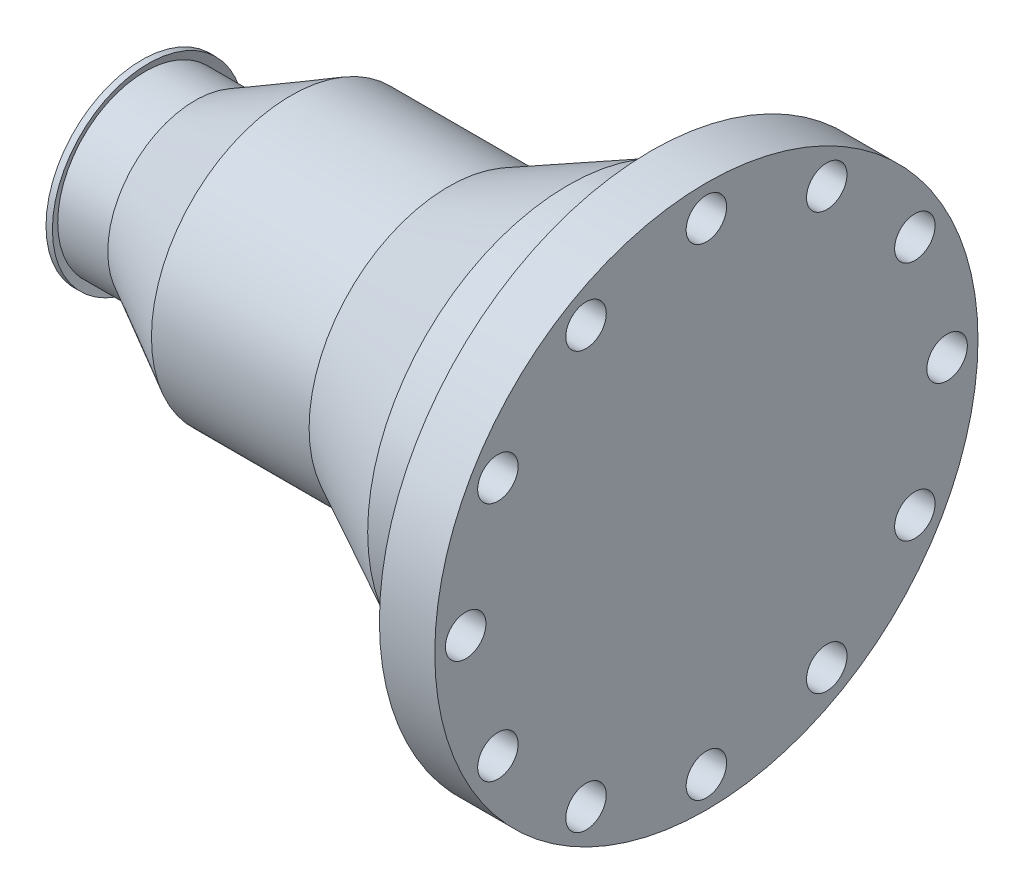
ISO-10303-21;
HEADER;
FILE_DESCRIPTION(('STEP AP214'),'2;1');
FILE_NAME('part.step','',(''),(''),'','','');
FILE_SCHEMA(('AUTOMOTIVE_DESIGN { 1 0 10303 214 1 1 1 1 }'));
ENDSEC;
DATA;
#1=APPLICATION_CONTEXT('core data for automotive mechanical design processes');
#2=APPLICATION_PROTOCOL_DEFINITION('international standard','automotive_design',2000,#1);
#3=PRODUCT_CONTEXT('',#1,'mechanical');
#4=PRODUCT('Part','Part','',(#3));
#5=PRODUCT_RELATED_PRODUCT_CATEGORY('part','',(#4));
#6=PRODUCT_DEFINITION_FORMATION('','',#4);
#7=PRODUCT_DEFINITION_CONTEXT('part definition',#1,'design');
#8=PRODUCT_DEFINITION('design','',#6,#7);
#9=PRODUCT_DEFINITION_SHAPE('','',#8);
#10=(LENGTH_UNIT() NAMED_UNIT(*) SI_UNIT(.MILLI.,.METRE.));
#11=(NAMED_UNIT(*) PLANE_ANGLE_UNIT() SI_UNIT($,.RADIAN.));
#12=(NAMED_UNIT(*) SI_UNIT($,.STERADIAN.) SOLID_ANGLE_UNIT());
#13=UNCERTAINTY_MEASURE_WITH_UNIT(LENGTH_MEASURE(1.E-05),#10,'distance_accuracy_value','');
#14=(GEOMETRIC_REPRESENTATION_CONTEXT(3) GLOBAL_UNCERTAINTY_ASSIGNED_CONTEXT((#13)) GLOBAL_UNIT_ASSIGNED_CONTEXT((#10,
#11,#12)) REPRESENTATION_CONTEXT('',''));
#15=CARTESIAN_POINT('',(0.,0.,0.));
#16=DIRECTION('',(0.,0.,1.));
#17=DIRECTION('',(1.,0.,0.));
#18=AXIS2_PLACEMENT_3D('',#15,#16,#17);
#19=CARTESIAN_POINT('',(0.,0.,0.));
#20=DIRECTION('',(1.,0.,0.));
#21=DIRECTION('',(0.,0.,-1.));
#22=AXIS2_PLACEMENT_3D('',#19,#20,#21);
#23=PLANE('',#22);
#24=CARTESIAN_POINT('',(0.,0.,0.));
#25=DIRECTION('',(-1.,0.,0.));
#26=DIRECTION('',(0.,0.,1.));
#27=AXIS2_PLACEMENT_3D('',#24,#25,#26);
#28=CIRCLE('',#27,31.);
#29=CARTESIAN_POINT('',(0.,0.,31.));
#30=VERTEX_POINT('',#29);
#31=EDGE_CURVE('E80',#30,#30,#28,.T.);
#32=ORIENTED_EDGE('',*,*,#31,.F.);
#33=EDGE_LOOP('',(#32));
#34=FACE_BOUND('',#33,.T.);
#35=CARTESIAN_POINT('',(0.,0.,0.));
#36=DIRECTION('',(-1.,0.,0.));
#37=DIRECTION('',(0.,0.,1.));
#38=AXIS2_PLACEMENT_3D('',#35,#36,#37);
#39=CIRCLE('',#38,45.);
#40=CARTESIAN_POINT('',(0.,0.,45.));
#41=VERTEX_POINT('',#40);
#42=EDGE_CURVE('E10',#41,#41,#39,.T.);
#43=ORIENTED_EDGE('',*,*,#42,.T.);
#44=EDGE_LOOP('',(#43));
#45=FACE_BOUND('',#44,.T.);
#46=ADVANCED_FACE('F37',(#34,#45),#23,.F.);
#47=CARTESIAN_POINT('',(0.,0.,0.));
#48=DIRECTION('',(-1.,0.,0.));
#49=DIRECTION('',(0.,0.,1.));
#50=AXIS2_PLACEMENT_3D('',#47,#48,#49);
#51=CYLINDRICAL_SURFACE('',#50,45.);
#52=ORIENTED_EDGE('',*,*,#42,.F.);
#53=EDGE_LOOP('',(#52));
#54=FACE_BOUND('',#53,.T.);
#55=CARTESIAN_POINT('',(3.,0.,0.));
#56=DIRECTION('',(-1.,0.,0.));
#57=DIRECTION('',(0.,0.,1.));
#58=AXIS2_PLACEMENT_3D('',#55,#56,#57);
#59=CIRCLE('',#58,45.);
#60=CARTESIAN_POINT('',(3.,0.,45.));
#61=VERTEX_POINT('',#60);
#62=EDGE_CURVE('E43',#61,#61,#59,.T.);
#63=ORIENTED_EDGE('',*,*,#62,.T.);
#64=EDGE_LOOP('',(#63));
#65=FACE_BOUND('',#64,.T.);
#66=ADVANCED_FACE('F214',(#54,#65),#51,.T.);
#67=CARTESIAN_POINT('',(1.5,0.,0.));
#68=DIRECTION('',(1.,0.,0.));
#69=DIRECTION('',(0.,0.,-1.));
#70=AXIS2_PLACEMENT_3D('',#67,#68,#69);
#71=CONICAL_SURFACE('',#70,41.,1.21202565652432);
#72=ORIENTED_EDGE('',*,*,#62,.F.);
#73=EDGE_LOOP('',(#72));
#74=FACE_BOUND('',#73,.T.);
#75=CARTESIAN_POINT('',(1.5,0.,0.));
#76=DIRECTION('',(-1.,0.,0.));
#77=DIRECTION('',(0.,0.,1.));
#78=AXIS2_PLACEMENT_3D('',#75,#76,#77);
#79=CIRCLE('',#78,41.);
#80=CARTESIAN_POINT('',(1.5,0.,41.));
#81=VERTEX_POINT('',#80);
#82=EDGE_CURVE('E47',#81,#81,#79,.T.);
#83=ORIENTED_EDGE('',*,*,#82,.T.);
#84=EDGE_LOOP('',(#83));
#85=FACE_BOUND('',#84,.T.);
#86=ADVANCED_FACE('F220',(#74,#85),#71,.F.);
#87=CARTESIAN_POINT('',(0.,0.,0.));
#88=DIRECTION('',(-1.,0.,0.));
#89=DIRECTION('',(0.,0.,1.));
#90=AXIS2_PLACEMENT_3D('',#87,#88,#89);
#91=CYLINDRICAL_SURFACE('',#90,41.);
#92=ORIENTED_EDGE('',*,*,#82,.F.);
#93=EDGE_LOOP('',(#92));
#94=FACE_BOUND('',#93,.T.);
#95=CARTESIAN_POINT('',(25.,0.,0.));
#96=DIRECTION('',(-1.,0.,0.));
#97=DIRECTION('',(0.,0.,1.));
#98=AXIS2_PLACEMENT_3D('',#95,#96,#97);
#99=CIRCLE('',#98,41.);
#100=CARTESIAN_POINT('',(25.,0.,41.));
#101=VERTEX_POINT('',#100);
#102=EDGE_CURVE('E51',#101,#101,#99,.T.);
#103=ORIENTED_EDGE('',*,*,#102,.T.);
#104=EDGE_LOOP('',(#103));
#105=FACE_BOUND('',#104,.T.);
#106=ADVANCED_FACE('F454',(#94,#105),#91,.T.);
#107=CARTESIAN_POINT('',(70.,0.,0.));
#108=DIRECTION('',(1.,0.,0.));
#109=DIRECTION('',(0.,0.,-1.));
#110=AXIS2_PLACEMENT_3D('',#107,#108,#109);
#111=CONICAL_SURFACE('',#110,65.5,0.498567905638218);
#112=ORIENTED_EDGE('',*,*,#102,.F.);
#113=EDGE_LOOP('',(#112));
#114=FACE_BOUND('',#113,.T.);
#115=CARTESIAN_POINT('',(70.,0.,0.));
#116=DIRECTION('',(-1.,0.,0.));
#117=DIRECTION('',(0.,0.,1.));
#118=AXIS2_PLACEMENT_3D('',#115,#116,#117);
#119=CIRCLE('',#118,65.5);
#120=CARTESIAN_POINT('',(70.,0.,65.5));
#121=VERTEX_POINT('',#120);
#122=EDGE_CURVE('E56',#121,#121,#119,.T.);
#123=ORIENTED_EDGE('',*,*,#122,.T.);
#124=EDGE_LOOP('',(#123));
#125=FACE_BOUND('',#124,.T.);
#126=ADVANCED_FACE('F445',(#114,#125),#111,.T.);
#127=CARTESIAN_POINT('',(0.,0.,0.));
#128=DIRECTION('',(-1.,0.,0.));
#129=DIRECTION('',(0.,0.,1.));
#130=AXIS2_PLACEMENT_3D('',#127,#128,#129);
#131=CYLINDRICAL_SURFACE('',#130,65.5);
#132=ORIENTED_EDGE('',*,*,#122,.F.);
#133=EDGE_LOOP('',(#132));
#134=FACE_BOUND('',#133,.T.);
#135=CARTESIAN_POINT('',(144.,0.,0.));
#136=DIRECTION('',(-1.,0.,0.));
#137=DIRECTION('',(0.,0.,1.));
#138=AXIS2_PLACEMENT_3D('',#135,#136,#137);
#139=CIRCLE('',#138,65.5);
#140=CARTESIAN_POINT('',(144.,0.,65.5));
#141=VERTEX_POINT('',#140);
#142=EDGE_CURVE('E59',#141,#141,#139,.T.);
#143=ORIENTED_EDGE('',*,*,#142,.T.);
#144=EDGE_LOOP('',(#143));
#145=FACE_BOUND('',#144,.T.);
#146=ADVANCED_FACE('F436',(#134,#145),#131,.T.);
#147=CARTESIAN_POINT('',(200.,0.,0.));
#148=DIRECTION('',(1.,0.,0.));
#149=DIRECTION('',(0.,0.,-1.));
#150=AXIS2_PLACEMENT_3D('',#147,#148,#149);
#151=CONICAL_SURFACE('',#150,94.,0.470764926542016);
#152=ORIENTED_EDGE('',*,*,#142,.F.);
#153=EDGE_LOOP('',(#152));
#154=FACE_BOUND('',#153,.T.);
#155=CARTESIAN_POINT('',(200.,0.,0.));
#156=DIRECTION('',(-1.,0.,0.));
#157=DIRECTION('',(0.,0.,1.));
#158=AXIS2_PLACEMENT_3D('',#155,#156,#157);
#159=CIRCLE('',#158,94.);
#160=CARTESIAN_POINT('',(200.,0.,94.));
#161=VERTEX_POINT('',#160);
#162=EDGE_CURVE('E62',#161,#161,#159,.T.);
#163=ORIENTED_EDGE('',*,*,#162,.T.);
#164=EDGE_LOOP('',(#163));
#165=FACE_BOUND('',#164,.T.);
#166=ADVANCED_FACE('F427',(#154,#165),#151,.T.);
#167=CARTESIAN_POINT('',(0.,0.,0.));
#168=DIRECTION('',(-1.,0.,0.));
#169=DIRECTION('',(0.,0.,1.));
#170=AXIS2_PLACEMENT_3D('',#167,#168,#169);
#171=CYLINDRICAL_SURFACE('',#170,94.);
#172=ORIENTED_EDGE('',*,*,#162,.F.);
#173=EDGE_LOOP('',(#172));
#174=FACE_BOUND('',#173,.T.);
#175=CARTESIAN_POINT('',(220.,0.,0.));
#176=DIRECTION('',(-1.,0.,0.));
#177=DIRECTION('',(0.,0.,1.));
#178=AXIS2_PLACEMENT_3D('',#175,#176,#177);
#179=CIRCLE('',#178,94.);
#180=CARTESIAN_POINT('',(220.,0.,94.));
#181=VERTEX_POINT('',#180);
#182=EDGE_CURVE('E65',#181,#181,#179,.T.);
#183=ORIENTED_EDGE('',*,*,#182,.T.);
#184=EDGE_LOOP('',(#183));
#185=FACE_BOUND('',#184,.T.);
#186=ADVANCED_FACE('F418',(#174,#185),#171,.T.);
#187=CARTESIAN_POINT('',(220.,94.,0.));
#188=DIRECTION('',(1.,0.,0.));
#189=DIRECTION('',(0.,0.,-1.));
#190=AXIS2_PLACEMENT_3D('',#187,#188,#189);
#191=PLANE('',#190);
#192=ORIENTED_EDGE('',*,*,#182,.F.);
#193=EDGE_LOOP('',(#192));
#194=FACE_BOUND('',#193,.T.);
#195=CARTESIAN_POINT('',(220.,0.,0.));
#196=DIRECTION('',(-1.,0.,0.));
#197=DIRECTION('',(0.,0.,1.));
#198=AXIS2_PLACEMENT_3D('',#195,#196,#197);
#199=CIRCLE('',#198,95.);
#200=CARTESIAN_POINT('',(220.,0.,95.));
#201=VERTEX_POINT('',#200);
#202=EDGE_CURVE('E68',#201,#201,#199,.T.);
#203=ORIENTED_EDGE('',*,*,#202,.T.);
#204=EDGE_LOOP('',(#203));
#205=FACE_BOUND('',#204,.T.);
#206=ADVANCED_FACE('F409',(#194,#205),#191,.F.);
#207=CARTESIAN_POINT('',(0.,0.,0.));
#208=DIRECTION('',(-1.,0.,0.));
#209=DIRECTION('',(0.,0.,1.));
#210=AXIS2_PLACEMENT_3D('',#207,#208,#209);
#211=CYLINDRICAL_SURFACE('',#210,95.);
#212=ORIENTED_EDGE('',*,*,#202,.F.);
#213=EDGE_LOOP('',(#212));
#214=FACE_BOUND('',#213,.T.);
#215=CARTESIAN_POINT('',(239.,0.,0.));
#216=DIRECTION('',(-1.,0.,0.));
#217=DIRECTION('',(0.,0.,1.));
#218=AXIS2_PLACEMENT_3D('',#215,#216,#217);
#219=CIRCLE('',#218,95.);
#220=CARTESIAN_POINT('',(239.,0.,95.));
#221=VERTEX_POINT('',#220);
#222=EDGE_CURVE('E71',#221,#221,#219,.T.);
#223=ORIENTED_EDGE('',*,*,#222,.T.);
#224=EDGE_LOOP('',(#223));
#225=FACE_BOUND('',#224,.T.);
#226=ADVANCED_FACE('F210',(#214,#225),#211,.T.);
#227=CARTESIAN_POINT('',(239.,100.,0.));
#228=DIRECTION('',(1.,0.,0.));
#229=DIRECTION('',(0.,0.,-1.));
#230=AXIS2_PLACEMENT_3D('',#227,#228,#229);
#231=PLANE('',#230);
#232=CARTESIAN_POINT('',(239.,97.8608706276416,-56.5));
#233=DIRECTION('',(1.,0.,0.));
#234=DIRECTION('',(0.,0.,-1.));
#235=AXIS2_PLACEMENT_3D('',#232,#233,#234);
#236=CIRCLE('',#235,9.50000000000001);
#237=CARTESIAN_POINT('',(239.,97.8608706276416,-66.));
#238=VERTEX_POINT('',#237);
#239=EDGE_CURVE('E161',#238,#238,#236,.F.);
#240=ORIENTED_EDGE('',*,*,#239,.F.);
#241=EDGE_LOOP('',(#240));
#242=FACE_BOUND('',#241,.T.);
#243=CARTESIAN_POINT('',(239.,56.4999999999999,-97.8608706276416));
#244=DIRECTION('',(1.,0.,0.));
#245=DIRECTION('',(0.,0.,-1.));
#246=AXIS2_PLACEMENT_3D('',#243,#244,#245);
#247=CIRCLE('',#246,9.5);
#248=CARTESIAN_POINT('',(239.,56.4999999999999,-107.360870627642));
#249=VERTEX_POINT('',#248);
#250=EDGE_CURVE('E155',#249,#249,#247,.F.);
#251=ORIENTED_EDGE('',*,*,#250,.F.);
#252=EDGE_LOOP('',(#251));
#253=FACE_BOUND('',#252,.T.);
#254=CARTESIAN_POINT('',(239.,0.,-113.));
#255=DIRECTION('',(1.,0.,0.));
#256=DIRECTION('',(0.,0.,-1.));
#257=AXIS2_PLACEMENT_3D('',#254,#255,#256);
#258=CIRCLE('',#257,9.49999999999999);
#259=CARTESIAN_POINT('',(239.,0.,-122.5));
#260=VERTEX_POINT('',#259);
#261=EDGE_CURVE('E149',#260,#260,#258,.F.);
#262=ORIENTED_EDGE('',*,*,#261,.F.);
#263=EDGE_LOOP('',(#262));
#264=FACE_BOUND('',#263,.T.);
#265=CARTESIAN_POINT('',(239.,-56.5,-97.8608706276415));
#266=DIRECTION('',(1.,0.,0.));
#267=DIRECTION('',(0.,0.,-1.));
#268=AXIS2_PLACEMENT_3D('',#265,#266,#267);
#269=CIRCLE('',#268,9.5);
#270=CARTESIAN_POINT('',(239.,-56.5,-107.360870627642));
#271=VERTEX_POINT('',#270);
#272=EDGE_CURVE('E143',#271,#271,#269,.F.);
#273=ORIENTED_EDGE('',*,*,#272,.F.);
#274=EDGE_LOOP('',(#273));
#275=FACE_BOUND('',#274,.T.);
#276=CARTESIAN_POINT('',(239.,-97.8608706276416,-56.5));
#277=DIRECTION('',(1.,0.,0.));
#278=DIRECTION('',(0.,0.,-1.));
#279=AXIS2_PLACEMENT_3D('',#276,#277,#278);
#280=CIRCLE('',#279,9.50000000000001);
#281=CARTESIAN_POINT('',(239.,-97.8608706276416,-66.));
#282=VERTEX_POINT('',#281);
#283=EDGE_CURVE('E137',#282,#282,#280,.F.);
#284=ORIENTED_EDGE('',*,*,#283,.F.);
#285=EDGE_LOOP('',(#284));
#286=FACE_BOUND('',#285,.T.);
#287=CARTESIAN_POINT('',(239.,-113.,0.));
#288=DIRECTION('',(1.,0.,0.));
#289=DIRECTION('',(0.,0.,-1.));
#290=AXIS2_PLACEMENT_3D('',#287,#288,#289);
#291=CIRCLE('',#290,9.49999999999998);
#292=CARTESIAN_POINT('',(239.,-113.,-9.49999999999998));
#293=VERTEX_POINT('',#292);
#294=EDGE_CURVE('E131',#293,#293,#291,.F.);
#295=ORIENTED_EDGE('',*,*,#294,.F.);
#296=EDGE_LOOP('',(#295));
#297=FACE_BOUND('',#296,.T.);
#298=CARTESIAN_POINT('',(239.,-97.8608706276415,56.5));
#299=DIRECTION('',(1.,0.,0.));
#300=DIRECTION('',(0.,0.,-1.));
#301=AXIS2_PLACEMENT_3D('',#298,#299,#300);
#302=CIRCLE('',#301,9.5);
#303=CARTESIAN_POINT('',(239.,-97.8608706276415,47.));
#304=VERTEX_POINT('',#303);
#305=EDGE_CURVE('E125',#304,#304,#302,.F.);
#306=ORIENTED_EDGE('',*,*,#305,.F.);
#307=EDGE_LOOP('',(#306));
#308=FACE_BOUND('',#307,.T.);
#309=CARTESIAN_POINT('',(239.,-56.5,97.8608706276416));
#310=DIRECTION('',(1.,0.,0.));
#311=DIRECTION('',(0.,0.,-1.));
#312=AXIS2_PLACEMENT_3D('',#309,#310,#311);
#313=CIRCLE('',#312,9.5);
#314=CARTESIAN_POINT('',(239.,-56.5,88.3608706276416));
#315=VERTEX_POINT('',#314);
#316=EDGE_CURVE('E119',#315,#315,#313,.F.);
#317=ORIENTED_EDGE('',*,*,#316,.F.);
#318=EDGE_LOOP('',(#317));
#319=FACE_BOUND('',#318,.T.);
#320=CARTESIAN_POINT('',(239.,0.,113.));
#321=DIRECTION('',(1.,0.,0.));
#322=DIRECTION('',(0.,0.,-1.));
#323=AXIS2_PLACEMENT_3D('',#320,#321,#322);
#324=CIRCLE('',#323,9.49999999999999);
#325=CARTESIAN_POINT('',(239.,0.,103.5));
#326=VERTEX_POINT('',#325);
#327=EDGE_CURVE('E113',#326,#326,#324,.F.);
#328=ORIENTED_EDGE('',*,*,#327,.F.);
#329=EDGE_LOOP('',(#328));
#330=FACE_BOUND('',#329,.T.);
#331=CARTESIAN_POINT('',(239.,56.5,97.8608706276416));
#332=DIRECTION('',(1.,0.,0.));
#333=DIRECTION('',(0.,0.,-1.));
#334=AXIS2_PLACEMENT_3D('',#331,#332,#333);
#335=CIRCLE('',#334,9.5);
#336=CARTESIAN_POINT('',(239.,56.5,88.3608706276416));
#337=VERTEX_POINT('',#336);
#338=EDGE_CURVE('E107',#337,#337,#335,.F.);
#339=ORIENTED_EDGE('',*,*,#338,.F.);
#340=EDGE_LOOP('',(#339));
#341=FACE_BOUND('',#340,.T.);
#342=CARTESIAN_POINT('',(239.,97.8608706276416,56.5));
#343=DIRECTION('',(1.,0.,0.));
#344=DIRECTION('',(0.,0.,-1.));
#345=AXIS2_PLACEMENT_3D('',#342,#343,#344);
#346=CIRCLE('',#345,9.5);
#347=CARTESIAN_POINT('',(239.,97.8608706276416,47.));
#348=VERTEX_POINT('',#347);
#349=EDGE_CURVE('E101',#348,#348,#346,.F.);
#350=ORIENTED_EDGE('',*,*,#349,.F.);
#351=EDGE_LOOP('',(#350));
#352=FACE_BOUND('',#351,.T.);
#353=CARTESIAN_POINT('',(239.,113.,0.));
#354=DIRECTION('',(1.,0.,0.));
#355=DIRECTION('',(0.,0.,-1.));
#356=AXIS2_PLACEMENT_3D('',#353,#354,#355);
#357=CIRCLE('',#356,9.50000000000001);
#358=CARTESIAN_POINT('',(239.,113.,-9.50000000000001));
#359=VERTEX_POINT('',#358);
#360=EDGE_CURVE('E95',#359,#359,#357,.F.);
#361=ORIENTED_EDGE('',*,*,#360,.F.);
#362=EDGE_LOOP('',(#361));
#363=FACE_BOUND('',#362,.T.);
#364=ORIENTED_EDGE('',*,*,#222,.F.);
#365=EDGE_LOOP('',(#364));
#366=FACE_BOUND('',#365,.T.);
#367=CARTESIAN_POINT('',(239.,0.,0.));
#368=DIRECTION('',(-1.,0.,0.));
#369=DIRECTION('',(0.,0.,1.));
#370=AXIS2_PLACEMENT_3D('',#367,#368,#369);
#371=CIRCLE('',#370,127.5);
#372=CARTESIAN_POINT('',(239.,0.,127.5));
#373=VERTEX_POINT('',#372);
#374=EDGE_CURVE('E74',#373,#373,#371,.T.);
#375=ORIENTED_EDGE('',*,*,#374,.T.);
#376=EDGE_LOOP('',(#375));
#377=FACE_BOUND('',#376,.T.);
#378=ADVANCED_FACE('F202',(#242,#253,#264,#275,#286,#297,#308,#319,#330,#341,#352,#363,#366,
#377),#231,.F.);
#379=CARTESIAN_POINT('',(0.,0.,0.));
#380=DIRECTION('',(-1.,0.,0.));
#381=DIRECTION('',(0.,0.,1.));
#382=AXIS2_PLACEMENT_3D('',#379,#380,#381);
#383=CYLINDRICAL_SURFACE('',#382,127.5);
#384=ORIENTED_EDGE('',*,*,#374,.F.);
#385=EDGE_LOOP('',(#384));
#386=FACE_BOUND('',#385,.T.);
#387=CARTESIAN_POINT('',(265.,0.,0.));
#388=DIRECTION('',(-1.,0.,0.));
#389=DIRECTION('',(0.,0.,1.));
#390=AXIS2_PLACEMENT_3D('',#387,#388,#389);
#391=CIRCLE('',#390,127.5);
#392=CARTESIAN_POINT('',(265.,0.,127.5));
#393=VERTEX_POINT('',#392);
#394=EDGE_CURVE('E77',#393,#393,#391,.T.);
#395=ORIENTED_EDGE('',*,*,#394,.T.);
#396=EDGE_LOOP('',(#395));
#397=FACE_BOUND('',#396,.T.);
#398=ADVANCED_FACE('F175',(#386,#397),#383,.T.);
#399=CARTESIAN_POINT('',(265.,127.5,0.));
#400=DIRECTION('',(-1.,0.,0.));
#401=DIRECTION('',(0.,0.,1.));
#402=AXIS2_PLACEMENT_3D('',#399,#400,#401);
#403=PLANE('',#402);
#404=CARTESIAN_POINT('',(265.,97.8608706276416,-56.5));
#405=DIRECTION('',(1.,0.,0.));
#406=DIRECTION('',(0.,0.,-1.));
#407=AXIS2_PLACEMENT_3D('',#404,#405,#406);
#408=CIRCLE('',#407,9.50000000000001);
#409=CARTESIAN_POINT('',(265.,97.8608706276416,-66.));
#410=VERTEX_POINT('',#409);
#411=EDGE_CURVE('E164',#410,#410,#408,.T.);
#412=ORIENTED_EDGE('',*,*,#411,.F.);
#413=EDGE_LOOP('',(#412));
#414=FACE_BOUND('',#413,.T.);
#415=CARTESIAN_POINT('',(265.,56.4999999999999,-97.8608706276416));
#416=DIRECTION('',(1.,0.,0.));
#417=DIRECTION('',(0.,0.,-1.));
#418=AXIS2_PLACEMENT_3D('',#415,#416,#417);
#419=CIRCLE('',#418,9.5);
#420=CARTESIAN_POINT('',(265.,56.4999999999999,-107.360870627642));
#421=VERTEX_POINT('',#420);
#422=EDGE_CURVE('E158',#421,#421,#419,.T.);
#423=ORIENTED_EDGE('',*,*,#422,.F.);
#424=EDGE_LOOP('',(#423));
#425=FACE_BOUND('',#424,.T.);
#426=CARTESIAN_POINT('',(265.,0.,-113.));
#427=DIRECTION('',(1.,0.,0.));
#428=DIRECTION('',(0.,0.,-1.));
#429=AXIS2_PLACEMENT_3D('',#426,#427,#428);
#430=CIRCLE('',#429,9.49999999999999);
#431=CARTESIAN_POINT('',(265.,0.,-122.5));
#432=VERTEX_POINT('',#431);
#433=EDGE_CURVE('E152',#432,#432,#430,.T.);
#434=ORIENTED_EDGE('',*,*,#433,.F.);
#435=EDGE_LOOP('',(#434));
#436=FACE_BOUND('',#435,.T.);
#437=CARTESIAN_POINT('',(265.,-56.5,-97.8608706276415));
#438=DIRECTION('',(1.,0.,0.));
#439=DIRECTION('',(0.,0.,-1.));
#440=AXIS2_PLACEMENT_3D('',#437,#438,#439);
#441=CIRCLE('',#440,9.5);
#442=CARTESIAN_POINT('',(265.,-56.5,-107.360870627642));
#443=VERTEX_POINT('',#442);
#444=EDGE_CURVE('E146',#443,#443,#441,.T.);
#445=ORIENTED_EDGE('',*,*,#444,.F.);
#446=EDGE_LOOP('',(#445));
#447=FACE_BOUND('',#446,.T.);
#448=CARTESIAN_POINT('',(265.,-97.8608706276416,-56.5));
#449=DIRECTION('',(1.,0.,0.));
#450=DIRECTION('',(0.,0.,-1.));
#451=AXIS2_PLACEMENT_3D('',#448,#449,#450);
#452=CIRCLE('',#451,9.50000000000001);
#453=CARTESIAN_POINT('',(265.,-97.8608706276416,-66.));
#454=VERTEX_POINT('',#453);
#455=EDGE_CURVE('E140',#454,#454,#452,.T.);
#456=ORIENTED_EDGE('',*,*,#455,.F.);
#457=EDGE_LOOP('',(#456));
#458=FACE_BOUND('',#457,.T.);
#459=CARTESIAN_POINT('',(265.,-113.,0.));
#460=DIRECTION('',(1.,0.,0.));
#461=DIRECTION('',(0.,0.,-1.));
#462=AXIS2_PLACEMENT_3D('',#459,#460,#461);
#463=CIRCLE('',#462,9.49999999999998);
#464=CARTESIAN_POINT('',(265.,-113.,-9.49999999999998));
#465=VERTEX_POINT('',#464);
#466=EDGE_CURVE('E134',#465,#465,#463,.T.);
#467=ORIENTED_EDGE('',*,*,#466,.F.);
#468=EDGE_LOOP('',(#467));
#469=FACE_BOUND('',#468,.T.);
#470=CARTESIAN_POINT('',(265.,-97.8608706276415,56.5));
#471=DIRECTION('',(1.,0.,0.));
#472=DIRECTION('',(0.,0.,-1.));
#473=AXIS2_PLACEMENT_3D('',#470,#471,#472);
#474=CIRCLE('',#473,9.5);
#475=CARTESIAN_POINT('',(265.,-97.8608706276415,47.));
#476=VERTEX_POINT('',#475);
#477=EDGE_CURVE('E128',#476,#476,#474,.T.);
#478=ORIENTED_EDGE('',*,*,#477,.F.);
#479=EDGE_LOOP('',(#478));
#480=FACE_BOUND('',#479,.T.);
#481=CARTESIAN_POINT('',(265.,-56.5,97.8608706276416));
#482=DIRECTION('',(1.,0.,0.));
#483=DIRECTION('',(0.,0.,-1.));
#484=AXIS2_PLACEMENT_3D('',#481,#482,#483);
#485=CIRCLE('',#484,9.5);
#486=CARTESIAN_POINT('',(265.,-56.5,88.3608706276416));
#487=VERTEX_POINT('',#486);
#488=EDGE_CURVE('E122',#487,#487,#485,.T.);
#489=ORIENTED_EDGE('',*,*,#488,.F.);
#490=EDGE_LOOP('',(#489));
#491=FACE_BOUND('',#490,.T.);
#492=CARTESIAN_POINT('',(265.,0.,113.));
#493=DIRECTION('',(1.,0.,0.));
#494=DIRECTION('',(0.,0.,-1.));
#495=AXIS2_PLACEMENT_3D('',#492,#493,#494);
#496=CIRCLE('',#495,9.49999999999999);
#497=CARTESIAN_POINT('',(265.,0.,103.5));
#498=VERTEX_POINT('',#497);
#499=EDGE_CURVE('E116',#498,#498,#496,.T.);
#500=ORIENTED_EDGE('',*,*,#499,.F.);
#501=EDGE_LOOP('',(#500));
#502=FACE_BOUND('',#501,.T.);
#503=CARTESIAN_POINT('',(265.,56.5,97.8608706276416));
#504=DIRECTION('',(1.,0.,0.));
#505=DIRECTION('',(0.,0.,-1.));
#506=AXIS2_PLACEMENT_3D('',#503,#504,#505);
#507=CIRCLE('',#506,9.5);
#508=CARTESIAN_POINT('',(265.,56.5,88.3608706276416));
#509=VERTEX_POINT('',#508);
#510=EDGE_CURVE('E110',#509,#509,#507,.T.);
#511=ORIENTED_EDGE('',*,*,#510,.F.);
#512=EDGE_LOOP('',(#511));
#513=FACE_BOUND('',#512,.T.);
#514=CARTESIAN_POINT('',(265.,97.8608706276416,56.5));
#515=DIRECTION('',(1.,0.,0.));
#516=DIRECTION('',(0.,0.,-1.));
#517=AXIS2_PLACEMENT_3D('',#514,#515,#516);
#518=CIRCLE('',#517,9.5);
#519=CARTESIAN_POINT('',(265.,97.8608706276416,47.));
#520=VERTEX_POINT('',#519);
#521=EDGE_CURVE('E104',#520,#520,#518,.T.);
#522=ORIENTED_EDGE('',*,*,#521,.F.);
#523=EDGE_LOOP('',(#522));
#524=FACE_BOUND('',#523,.T.);
#525=CARTESIAN_POINT('',(265.,113.,0.));
#526=DIRECTION('',(1.,0.,0.));
#527=DIRECTION('',(0.,0.,-1.));
#528=AXIS2_PLACEMENT_3D('',#525,#526,#527);
#529=CIRCLE('',#528,9.50000000000001);
#530=CARTESIAN_POINT('',(265.,113.,-9.50000000000001));
#531=VERTEX_POINT('',#530);
#532=EDGE_CURVE('E98',#531,#531,#529,.T.);
#533=ORIENTED_EDGE('',*,*,#532,.F.);
#534=EDGE_LOOP('',(#533));
#535=FACE_BOUND('',#534,.T.);
#536=ORIENTED_EDGE('',*,*,#394,.F.);
#537=EDGE_LOOP('',(#536));
#538=FACE_BOUND('',#537,.T.);
#539=ADVANCED_FACE('F171',(#414,#425,#436,#447,#458,#469,#480,#491,#502,#513,#524,#535,#538),
#403,.F.);
#540=CARTESIAN_POINT('',(0.,0.,0.));
#541=DIRECTION('',(-1.,0.,0.));
#542=DIRECTION('',(0.,0.,1.));
#543=AXIS2_PLACEMENT_3D('',#540,#541,#542);
#544=CYLINDRICAL_SURFACE('',#543,31.);
#545=ORIENTED_EDGE('',*,*,#31,.T.);
#546=EDGE_LOOP('',(#545));
#547=FACE_BOUND('',#546,.T.);
#548=CARTESIAN_POINT('',(38.,0.,0.));
#549=DIRECTION('',(-1.,0.,0.));
#550=DIRECTION('',(0.,0.,1.));
#551=AXIS2_PLACEMENT_3D('',#548,#549,#550);
#552=CIRCLE('',#551,31.);
#553=CARTESIAN_POINT('',(38.,0.,31.));
#554=VERTEX_POINT('',#553);
#555=EDGE_CURVE('E83',#554,#554,#552,.T.);
#556=ORIENTED_EDGE('',*,*,#555,.F.);
#557=EDGE_LOOP('',(#556));
#558=FACE_BOUND('',#557,.T.);
#559=ADVANCED_FACE('F174',(#547,#558),#544,.F.);
#560=CARTESIAN_POINT('',(111.880765,0.,0.));
#561=DIRECTION('',(1.,0.,0.));
#562=DIRECTION('',(0.,0.,-1.));
#563=AXIS2_PLACEMENT_3D('',#560,#561,#562);
#564=CONICAL_SURFACE('',#563,50.796291,0.261799383783959);
#565=ORIENTED_EDGE('',*,*,#555,.T.);
#566=EDGE_LOOP('',(#565));
#567=FACE_BOUND('',#566,.T.);
#568=CARTESIAN_POINT('',(111.880765,0.,0.));
#569=DIRECTION('',(-1.,0.,0.));
#570=DIRECTION('',(0.,0.,1.));
#571=AXIS2_PLACEMENT_3D('',#568,#569,#570);
#572=CIRCLE('',#571,50.796291);
#573=CARTESIAN_POINT('',(111.880765,50.796291,0.));
#574=VERTEX_POINT('',#573);
#575=EDGE_CURVE('E86',#574,#574,#572,.T.);
#576=ORIENTED_EDGE('',*,*,#575,.F.);
#577=EDGE_LOOP('',(#576));
#578=FACE_BOUND('',#577,.T.);
#579=ADVANCED_FACE('F225',(#567,#578),#564,.F.);
#580=CARTESIAN_POINT('',(125.491589933346,0.,0.));
#581=DIRECTION('',(-1.,0.,0.));
#582=DIRECTION('',(0.,1.,0.));
#583=AXIS2_PLACEMENT_3D('',#580,#581,#582);
#584=SPHERICAL_SURFACE('',#583,52.5881900689012);
#585=CARTESIAN_POINT('',(124.820646354263,0.,0.));
#586=DIRECTION('',(-1.,0.,0.));
#587=DIRECTION('',(0.,0.,1.));
#588=AXIS2_PLACEMENT_3D('',#585,#586,#587);
#589=CIRCLE('',#588,52.5839097960257);
#590=CARTESIAN_POINT('',(124.820646354263,52.5839097960257,0.));
#591=VERTEX_POINT('',#590);
#592=EDGE_CURVE('E89',#591,#591,#589,.T.);
#593=CARTESIAN_POINT('',(111.880765,50.796291,0.));
#594=CARTESIAN_POINT('',(112.012539355086,50.8315998434149,0.));
#595=CARTESIAN_POINT('',(112.144451111711,50.8663958966953,0.));
#596=CARTESIAN_POINT('',(112.408541425758,50.9349603645729,0.));
#597=CARTESIAN_POINT('',(112.540719983179,50.9687287791701,0.));
#598=CARTESIAN_POINT('',(112.805335896536,51.0352359112666,0.));
#599=CARTESIAN_POINT('',(112.937773252472,51.067974628766,0.));
#600=CARTESIAN_POINT('',(113.202898740571,51.1324203872961,0.));
#601=CARTESIAN_POINT('',(113.335586872734,51.1641274283268,0.));
#602=CARTESIAN_POINT('',(113.601205876973,51.2265079125656,0.));
#603=CARTESIAN_POINT('',(113.734136749049,51.2571813557738,0.));
#604=CARTESIAN_POINT('',(114.000233181786,51.3174927868132,0.));
#605=CARTESIAN_POINT('',(114.133398742446,51.3471307746445,0.));
#606=CARTESIAN_POINT('',(114.399956486892,51.40536949977,0.));
#607=CARTESIAN_POINT('',(114.533348670677,51.4339702370641,0.));
#608=CARTESIAN_POINT('',(114.800351582166,51.4901327288644,0.));
#609=CARTESIAN_POINT('',(114.933962309869,51.5176944833704,0.));
#610=CARTESIAN_POINT('',(115.201394216754,51.5717773402488,0.));
#611=CARTESIAN_POINT('',(115.335215395937,51.5982984426212,0.));
#612=CARTESIAN_POINT('',(115.603060100594,51.6502983889223,0.));
#613=CARTESIAN_POINT('',(115.73708362607,51.675777232851,0.));
#614=CARTESIAN_POINT('',(116.005324905872,51.7256911190799,0.));
#615=CARTESIAN_POINT('',(116.139542660199,51.7501261613801,0.));
#616=CARTESIAN_POINT('',(116.408164268499,51.7979509643879,0.));
#617=CARTESIAN_POINT('',(116.542568122472,51.8213407250955,0.));
#618=CARTESIAN_POINT('',(116.811553789588,51.8670735482636,0.));
#619=CARTESIAN_POINT('',(116.94613560273,51.8894166107241,0.));
#620=CARTESIAN_POINT('',(117.215469036929,51.9330546841394,0.));
#621=CARTESIAN_POINT('',(117.350220657985,51.9543496950942,0.));
#622=CARTESIAN_POINT('',(117.61988554647,51.9958903757169,0.));
#623=CARTESIAN_POINT('',(117.7547988139,52.0161360453849,0.));
#624=CARTESIAN_POINT('',(118.024778823801,52.0555768172087,0.));
#625=CARTESIAN_POINT('',(118.159845566273,52.0747719193645,0.));
#626=CARTESIAN_POINT('',(118.430124345634,52.1121103935687,0.));
#627=CARTESIAN_POINT('',(118.565336382522,52.1302537656171,0.));
#628=CARTESIAN_POINT('',(118.835897561289,52.1654876807116,0.));
#629=CARTESIAN_POINT('',(118.971246703167,52.1825782237577,0.));
#630=CARTESIAN_POINT('',(119.242073894183,52.2157054457198,0.));
#631=CARTESIAN_POINT('',(119.377551943321,52.2317421246359,0.));
#632=CARTESIAN_POINT('',(119.648628743317,52.2627606470396,0.));
#633=CARTESIAN_POINT('',(119.784227494176,52.2777424905273,0.));
#634=CARTESIAN_POINT('',(120.055537484767,52.3066504346649,0.));
#635=CARTESIAN_POINT('',(120.191248724498,52.3205765353147,0.));
#636=CARTESIAN_POINT('',(120.462775473172,52.3473721503103,0.));
#637=CARTESIAN_POINT('',(120.598590982115,52.3602416646561,0.));
#638=CARTESIAN_POINT('',(120.870318043234,52.3849233275719,0.));
#639=CARTESIAN_POINT('',(121.00622959541,52.3967354761419,0.));
#640=CARTESIAN_POINT('',(121.278140511202,52.4193016920769,0.));
#641=CARTESIAN_POINT('',(121.414139874818,52.4300557594418,0.));
#642=CARTESIAN_POINT('',(121.686218176376,52.4505051616203,0.));
#643=CARTESIAN_POINT('',(121.822297114319,52.460200496434,0.));
#644=CARTESIAN_POINT('',(122.094526322599,52.4785318462949,0.));
#645=CARTESIAN_POINT('',(122.230676592937,52.4871678613423,0.));
#646=CARTESIAN_POINT('',(122.503040219754,52.5033800485918,0.));
#647=CARTESIAN_POINT('',(122.639253576233,52.510956220794,0.));
#648=CARTESIAN_POINT('',(122.91173512526,52.5250482635552,0.));
#649=CARTESIAN_POINT('',(123.048003317806,52.5315641341141,0.));
#650=CARTESIAN_POINT('',(123.320586285578,52.5435351786787,0.));
#651=CARTESIAN_POINT('',(123.456901060802,52.5489903526844,0.));
#652=CARTESIAN_POINT('',(123.729568937692,52.5588396747128,0.));
#653=CARTESIAN_POINT('',(123.865922039358,52.5632338227356,0.));
#654=CARTESIAN_POINT('',(124.138658310668,52.5709608230162,0.));
#655=CARTESIAN_POINT('',(124.275041480313,52.5742936752739,0.));
#656=CARTESIAN_POINT('',(124.547829626942,52.579897895749,0.));
#657=CARTESIAN_POINT('',(124.684234603927,52.5821692639663,0.));
#658=CARTESIAN_POINT('',(124.820646354263,52.5839097960257,0.));
#659=B_SPLINE_CURVE_WITH_KNOTS('',3,(#593,#594,#595,#596,#597,#598,#599,#600,#601,#602,#603,
#604,#605,#606,#607,#608,#609,#610,#611,#612,#613,#614,#615,#616,#617,#618,#619,#620,#621,#622,
#623,#624,#625,#626,#627,#628,#629,#630,#631,#632,#633,#634,#635,#636,#637,#638,#639,#640,#641,
#642,#643,#644,#645,#646,#647,#648,#649,#650,#651,#652,#653,#654,#655,#656,#657,#658),
.UNSPECIFIED.,.F.,.F.,(4,2,2,2,2,2,2,2,2,2,2,2,2,2,2,2,2,2,2,2,2,2,2,2,2,2,2,2,2,2,2,2,4),(0.,
0.409267528758585,0.81853505751718,1.22780258627578,1.63707011503438,2.04633764379297,
2.45560517255156,2.86487270131016,3.27414023006875,3.68340775882735,4.09267528758595,
4.50194281634455,4.91121034510314,5.32047787386173,5.72974540262033,6.13901293137892,
6.54828046013752,6.9575479888961,7.36681551765471,7.77608304641329,8.18535057517189,
8.59461810393048,9.00388563268909,9.41315316144768,9.82242069020628,10.2316882189649,
10.6409557477235,11.0502232764821,11.4594908052407,11.8687583339992,12.2780258627578,
12.6872933915164,13.096560920275),.UNSPECIFIED.);
#660=EDGE_CURVE('BSEAM231',#574,#591,#659,.T.);
#661=ORIENTED_EDGE('',*,*,#575,.T.);
#662=ORIENTED_EDGE('',*,*,#592,.F.);
#663=ORIENTED_EDGE('',*,*,#660,.T.);
#664=ORIENTED_EDGE('',*,*,#660,.F.);
#665=EDGE_LOOP('',(#661,#663,#662,#664));
#666=FACE_BOUND('',#665,.T.);
#667=ADVANCED_FACE('F231',(#666),#584,.F.);
#668=CARTESIAN_POINT('',(0.,0.,0.));
#669=DIRECTION('',(-1.,0.,0.));
#670=DIRECTION('',(0.,0.,1.));
#671=AXIS2_PLACEMENT_3D('',#668,#669,#670);
#672=CYLINDRICAL_SURFACE('',#671,52.5839097960257);
#673=ORIENTED_EDGE('',*,*,#592,.T.);
#674=EDGE_LOOP('',(#673));
#675=FACE_BOUND('',#674,.T.);
#676=CARTESIAN_POINT('',(140.,0.,0.));
#677=DIRECTION('',(-1.,0.,0.));
#678=DIRECTION('',(0.,0.,1.));
#679=AXIS2_PLACEMENT_3D('',#676,#677,#678);
#680=CIRCLE('',#679,52.5839097960257);
#681=CARTESIAN_POINT('',(140.,0.,52.5839097960257));
#682=VERTEX_POINT('',#681);
#683=EDGE_CURVE('E92',#682,#682,#680,.T.);
#684=ORIENTED_EDGE('',*,*,#683,.F.);
#685=EDGE_LOOP('',(#684));
#686=FACE_BOUND('',#685,.T.);
#687=ADVANCED_FACE('F237',(#675,#686),#672,.F.);
#688=CARTESIAN_POINT('',(140.,52.5839097960257,0.));
#689=DIRECTION('',(-1.,0.,0.));
#690=DIRECTION('',(0.,0.,1.));
#691=AXIS2_PLACEMENT_3D('',#688,#689,#690);
#692=PLANE('',#691);
#693=ORIENTED_EDGE('',*,*,#683,.T.);
#694=EDGE_LOOP('',(#693));
#695=FACE_BOUND('',#694,.T.);
#696=ADVANCED_FACE('F243',(#695),#692,.T.);
#697=CARTESIAN_POINT('',(265.,113.,0.));
#698=DIRECTION('',(-1.,0.,0.));
#699=DIRECTION('',(0.,0.,1.));
#700=AXIS2_PLACEMENT_3D('',#697,#698,#699);
#701=CYLINDRICAL_SURFACE('',#700,9.50000000000001);
#702=ORIENTED_EDGE('',*,*,#532,.T.);
#703=EDGE_LOOP('',(#702));
#704=FACE_BOUND('',#703,.T.);
#705=ORIENTED_EDGE('',*,*,#360,.T.);
#706=EDGE_LOOP('',(#705));
#707=FACE_BOUND('',#706,.T.);
#708=ADVANCED_FACE('F248',(#704,#707),#701,.F.);
#709=CARTESIAN_POINT('',(265.,97.8608706276416,56.5));
#710=DIRECTION('',(-1.,0.,0.));
#711=DIRECTION('',(0.,0.,1.));
#712=AXIS2_PLACEMENT_3D('',#709,#710,#711);
#713=CYLINDRICAL_SURFACE('',#712,9.5);
#714=ORIENTED_EDGE('',*,*,#521,.T.);
#715=EDGE_LOOP('',(#714));
#716=FACE_BOUND('',#715,.T.);
#717=ORIENTED_EDGE('',*,*,#349,.T.);
#718=EDGE_LOOP('',(#717));
#719=FACE_BOUND('',#718,.T.);
#720=ADVANCED_FACE('F253',(#716,#719),#713,.F.);
#721=CARTESIAN_POINT('',(265.,56.5,97.8608706276416));
#722=DIRECTION('',(-1.,0.,0.));
#723=DIRECTION('',(0.,0.,1.));
#724=AXIS2_PLACEMENT_3D('',#721,#722,#723);
#725=CYLINDRICAL_SURFACE('',#724,9.5);
#726=ORIENTED_EDGE('',*,*,#510,.T.);
#727=EDGE_LOOP('',(#726));
#728=FACE_BOUND('',#727,.T.);
#729=ORIENTED_EDGE('',*,*,#338,.T.);
#730=EDGE_LOOP('',(#729));
#731=FACE_BOUND('',#730,.T.);
#732=ADVANCED_FACE('F259',(#728,#731),#725,.F.);
#733=CARTESIAN_POINT('',(265.,0.,113.));
#734=DIRECTION('',(-1.,0.,0.));
#735=DIRECTION('',(0.,0.,1.));
#736=AXIS2_PLACEMENT_3D('',#733,#734,#735);
#737=CYLINDRICAL_SURFACE('',#736,9.49999999999999);
#738=ORIENTED_EDGE('',*,*,#499,.T.);
#739=EDGE_LOOP('',(#738));
#740=FACE_BOUND('',#739,.T.);
#741=ORIENTED_EDGE('',*,*,#327,.T.);
#742=EDGE_LOOP('',(#741));
#743=FACE_BOUND('',#742,.T.);
#744=ADVANCED_FACE('F263',(#740,#743),#737,.F.);
#745=CARTESIAN_POINT('',(265.,-56.5,97.8608706276416));
#746=DIRECTION('',(-1.,0.,0.));
#747=DIRECTION('',(0.,0.,1.));
#748=AXIS2_PLACEMENT_3D('',#745,#746,#747);
#749=CYLINDRICAL_SURFACE('',#748,9.5);
#750=ORIENTED_EDGE('',*,*,#488,.T.);
#751=EDGE_LOOP('',(#750));
#752=FACE_BOUND('',#751,.T.);
#753=ORIENTED_EDGE('',*,*,#316,.T.);
#754=EDGE_LOOP('',(#753));
#755=FACE_BOUND('',#754,.T.);
#756=ADVANCED_FACE('F267',(#752,#755),#749,.F.);
#757=CARTESIAN_POINT('',(265.,-97.8608706276415,56.5));
#758=DIRECTION('',(-1.,0.,0.));
#759=DIRECTION('',(0.,0.,1.));
#760=AXIS2_PLACEMENT_3D('',#757,#758,#759);
#761=CYLINDRICAL_SURFACE('',#760,9.5);
#762=ORIENTED_EDGE('',*,*,#477,.T.);
#763=EDGE_LOOP('',(#762));
#764=FACE_BOUND('',#763,.T.);
#765=ORIENTED_EDGE('',*,*,#305,.T.);
#766=EDGE_LOOP('',(#765));
#767=FACE_BOUND('',#766,.T.);
#768=ADVANCED_FACE('F271',(#764,#767),#761,.F.);
#769=CARTESIAN_POINT('',(265.,-113.,0.));
#770=DIRECTION('',(-1.,0.,0.));
#771=DIRECTION('',(0.,0.,1.));
#772=AXIS2_PLACEMENT_3D('',#769,#770,#771);
#773=CYLINDRICAL_SURFACE('',#772,9.49999999999998);
#774=ORIENTED_EDGE('',*,*,#466,.T.);
#775=EDGE_LOOP('',(#774));
#776=FACE_BOUND('',#775,.T.);
#777=ORIENTED_EDGE('',*,*,#294,.T.);
#778=EDGE_LOOP('',(#777));
#779=FACE_BOUND('',#778,.T.);
#780=ADVANCED_FACE('F275',(#776,#779),#773,.F.);
#781=CARTESIAN_POINT('',(265.,-97.8608706276416,-56.5));
#782=DIRECTION('',(-1.,0.,0.));
#783=DIRECTION('',(0.,0.,1.));
#784=AXIS2_PLACEMENT_3D('',#781,#782,#783);
#785=CYLINDRICAL_SURFACE('',#784,9.50000000000001);
#786=ORIENTED_EDGE('',*,*,#455,.T.);
#787=EDGE_LOOP('',(#786));
#788=FACE_BOUND('',#787,.T.);
#789=ORIENTED_EDGE('',*,*,#283,.T.);
#790=EDGE_LOOP('',(#789));
#791=FACE_BOUND('',#790,.T.);
#792=ADVANCED_FACE('F279',(#788,#791),#785,.F.);
#793=CARTESIAN_POINT('',(265.,-56.5,-97.8608706276415));
#794=DIRECTION('',(-1.,0.,0.));
#795=DIRECTION('',(0.,0.,1.));
#796=AXIS2_PLACEMENT_3D('',#793,#794,#795);
#797=CYLINDRICAL_SURFACE('',#796,9.5);
#798=ORIENTED_EDGE('',*,*,#444,.T.);
#799=EDGE_LOOP('',(#798));
#800=FACE_BOUND('',#799,.T.);
#801=ORIENTED_EDGE('',*,*,#272,.T.);
#802=EDGE_LOOP('',(#801));
#803=FACE_BOUND('',#802,.T.);
#804=ADVANCED_FACE('F283',(#800,#803),#797,.F.);
#805=CARTESIAN_POINT('',(265.,0.,-113.));
#806=DIRECTION('',(-1.,0.,0.));
#807=DIRECTION('',(0.,0.,1.));
#808=AXIS2_PLACEMENT_3D('',#805,#806,#807);
#809=CYLINDRICAL_SURFACE('',#808,9.49999999999999);
#810=ORIENTED_EDGE('',*,*,#433,.T.);
#811=EDGE_LOOP('',(#810));
#812=FACE_BOUND('',#811,.T.);
#813=ORIENTED_EDGE('',*,*,#261,.T.);
#814=EDGE_LOOP('',(#813));
#815=FACE_BOUND('',#814,.T.);
#816=ADVANCED_FACE('F287',(#812,#815),#809,.F.);
#817=CARTESIAN_POINT('',(265.,56.4999999999999,-97.8608706276416));
#818=DIRECTION('',(-1.,0.,0.));
#819=DIRECTION('',(0.,0.,1.));
#820=AXIS2_PLACEMENT_3D('',#817,#818,#819);
#821=CYLINDRICAL_SURFACE('',#820,9.5);
#822=ORIENTED_EDGE('',*,*,#422,.T.);
#823=EDGE_LOOP('',(#822));
#824=FACE_BOUND('',#823,.T.);
#825=ORIENTED_EDGE('',*,*,#250,.T.);
#826=EDGE_LOOP('',(#825));
#827=FACE_BOUND('',#826,.T.);
#828=ADVANCED_FACE('F291',(#824,#827),#821,.F.);
#829=CARTESIAN_POINT('',(265.,97.8608706276416,-56.5));
#830=DIRECTION('',(-1.,0.,0.));
#831=DIRECTION('',(0.,0.,1.));
#832=AXIS2_PLACEMENT_3D('',#829,#830,#831);
#833=CYLINDRICAL_SURFACE('',#832,9.50000000000001);
#834=ORIENTED_EDGE('',*,*,#411,.T.);
#835=EDGE_LOOP('',(#834));
#836=FACE_BOUND('',#835,.T.);
#837=ORIENTED_EDGE('',*,*,#239,.T.);
#838=EDGE_LOOP('',(#837));
#839=FACE_BOUND('',#838,.T.);
#840=ADVANCED_FACE('F168',(#836,#839),#833,.F.);
#841=CLOSED_SHELL('',(#46,#66,#86,#106,#126,#146,#166,#186,#206,#226,#378,#398,#539,#559,#579,
#667,#687,#696,#708,#720,#732,#744,#756,#768,#780,#792,#804,#816,#828,#840));
#842=MANIFOLD_SOLID_BREP('B2',#841);
#843=ADVANCED_BREP_SHAPE_REPRESENTATION('',(#18,#842),#14);
#844=SHAPE_DEFINITION_REPRESENTATION(#9,#843);
ENDSEC;
END-ISO-10303-21;
